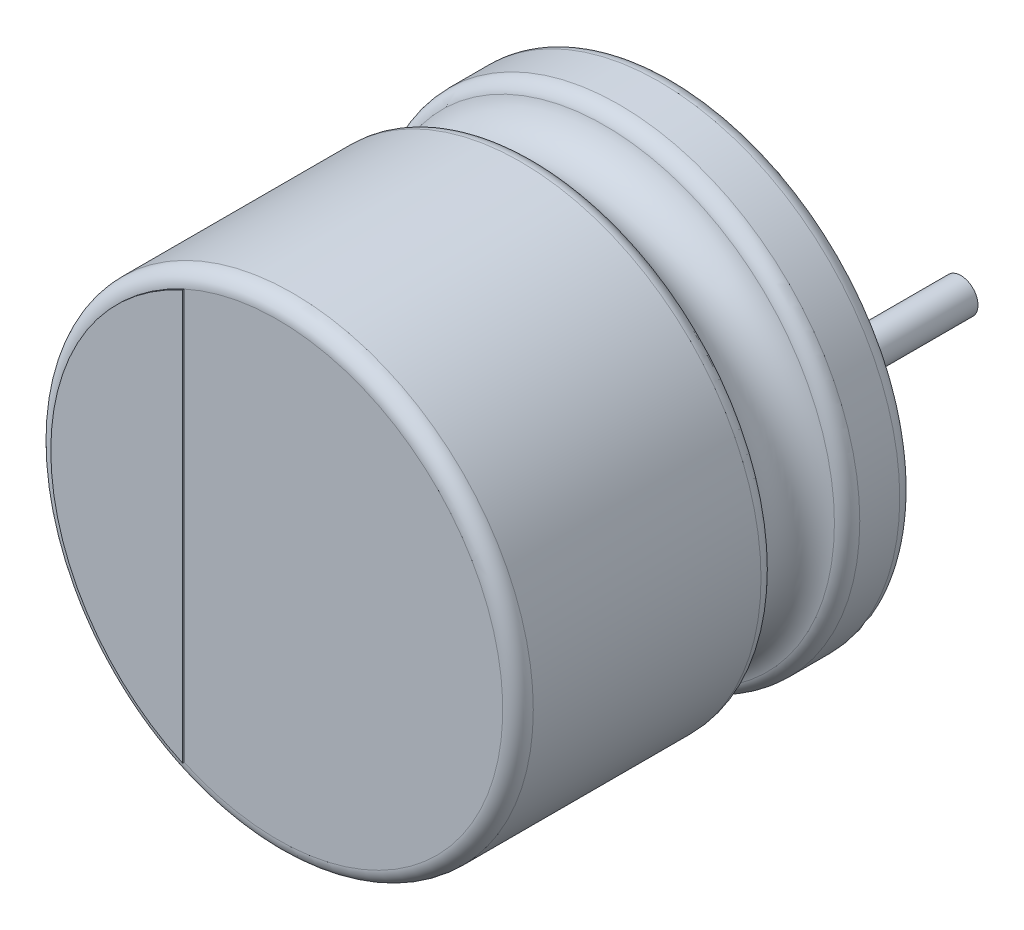
ISO-10303-21;
HEADER;
FILE_DESCRIPTION(('STEP AP214'),'2;1');
FILE_NAME('part.step','',(''),(''),'','','');
FILE_SCHEMA(('AUTOMOTIVE_DESIGN { 1 0 10303 214 1 1 1 1 }'));
ENDSEC;
DATA;
#1=APPLICATION_CONTEXT('core data for automotive mechanical design processes');
#2=APPLICATION_PROTOCOL_DEFINITION('international standard','automotive_design',2000,#1);
#3=PRODUCT_CONTEXT('',#1,'mechanical');
#4=PRODUCT('Part','Part','',(#3));
#5=PRODUCT_RELATED_PRODUCT_CATEGORY('part','',(#4));
#6=PRODUCT_DEFINITION_FORMATION('','',#4);
#7=PRODUCT_DEFINITION_CONTEXT('part definition',#1,'design');
#8=PRODUCT_DEFINITION('design','',#6,#7);
#9=PRODUCT_DEFINITION_SHAPE('','',#8);
#10=(LENGTH_UNIT() NAMED_UNIT(*) SI_UNIT(.MILLI.,.METRE.));
#11=(NAMED_UNIT(*) PLANE_ANGLE_UNIT() SI_UNIT($,.RADIAN.));
#12=(NAMED_UNIT(*) SI_UNIT($,.STERADIAN.) SOLID_ANGLE_UNIT());
#13=UNCERTAINTY_MEASURE_WITH_UNIT(LENGTH_MEASURE(1.E-05),#10,'distance_accuracy_value','');
#14=(GEOMETRIC_REPRESENTATION_CONTEXT(3) GLOBAL_UNCERTAINTY_ASSIGNED_CONTEXT((#13)) GLOBAL_UNIT_ASSIGNED_CONTEXT((#10,
#11,#12)) REPRESENTATION_CONTEXT('',''));
#15=CARTESIAN_POINT('',(0.,0.,0.));
#16=DIRECTION('',(0.,0.,1.));
#17=DIRECTION('',(1.,0.,0.));
#18=AXIS2_PLACEMENT_3D('',#15,#16,#17);
#19=CARTESIAN_POINT('',(-1.25,0.,-2.5));
#20=DIRECTION('',(0.,0.,1.));
#21=DIRECTION('',(1.,0.,0.));
#22=AXIS2_PLACEMENT_3D('',#19,#20,#21);
#23=CYLINDRICAL_SURFACE('',#22,0.225);
#24=CARTESIAN_POINT('',(-1.25,0.,-2.5));
#25=DIRECTION('',(0.,0.,1.));
#26=DIRECTION('',(-1.,0.,0.));
#27=AXIS2_PLACEMENT_3D('',#24,#25,#26);
#28=CIRCLE('',#27,0.225);
#29=CARTESIAN_POINT('',(-1.475,0.,-2.5));
#30=VERTEX_POINT('',#29);
#31=EDGE_CURVE('P0_E10',#30,#30,#28,.T.);
#32=ORIENTED_EDGE('',*,*,#31,.T.);
#33=EDGE_LOOP('',(#32));
#34=FACE_BOUND('',#33,.T.);
#35=CARTESIAN_POINT('',(-1.25,0.,0.));
#36=DIRECTION('',(0.,0.,1.));
#37=DIRECTION('',(-1.,0.,0.));
#38=AXIS2_PLACEMENT_3D('',#35,#36,#37);
#39=CIRCLE('',#38,0.225);
#40=CARTESIAN_POINT('',(-1.475,0.,0.));
#41=VERTEX_POINT('',#40);
#42=EDGE_CURVE('P0_E18',#41,#41,#39,.T.);
#43=ORIENTED_EDGE('',*,*,#42,.F.);
#44=EDGE_LOOP('',(#43));
#45=FACE_BOUND('',#44,.T.);
#46=ADVANCED_FACE('P0_F15',(#34,#45),#23,.T.);
#47=CARTESIAN_POINT('',(-1.25,0.,-2.5));
#48=DIRECTION('',(0.,0.,-1.));
#49=DIRECTION('',(-1.,0.,0.));
#50=AXIS2_PLACEMENT_3D('',#47,#48,#49);
#51=PLANE('',#50);
#52=ORIENTED_EDGE('',*,*,#31,.F.);
#53=EDGE_LOOP('',(#52));
#54=FACE_BOUND('',#53,.T.);
#55=ADVANCED_FACE('P0_F30',(#54),#51,.T.);
#56=CARTESIAN_POINT('',(-1.25,0.,0.));
#57=DIRECTION('',(0.,0.,-1.));
#58=DIRECTION('',(-1.,0.,0.));
#59=AXIS2_PLACEMENT_3D('',#56,#57,#58);
#60=PLANE('',#59);
#61=ORIENTED_EDGE('',*,*,#42,.T.);
#62=EDGE_LOOP('',(#61));
#63=FACE_BOUND('',#62,.T.);
#64=ADVANCED_FACE('P0_F27',(#63),#60,.F.);
#65=CLOSED_SHELL('',(#46,#55,#64));
#66=MANIFOLD_SOLID_BREP('P0_B1',#65);
#67=CARTESIAN_POINT('',(1.25,0.,-2.5));
#68=DIRECTION('',(0.,0.,1.));
#69=DIRECTION('',(1.,0.,0.));
#70=AXIS2_PLACEMENT_3D('',#67,#68,#69);
#71=CYLINDRICAL_SURFACE('',#70,0.225);
#72=CARTESIAN_POINT('',(1.25,0.,-2.5));
#73=DIRECTION('',(0.,0.,1.));
#74=DIRECTION('',(1.,0.,0.));
#75=AXIS2_PLACEMENT_3D('',#72,#73,#74);
#76=CIRCLE('',#75,0.225);
#77=CARTESIAN_POINT('',(1.475,0.,-2.5));
#78=VERTEX_POINT('',#77);
#79=EDGE_CURVE('P1_E10',#78,#78,#76,.T.);
#80=ORIENTED_EDGE('',*,*,#79,.T.);
#81=EDGE_LOOP('',(#80));
#82=FACE_BOUND('',#81,.T.);
#83=CARTESIAN_POINT('',(1.25,0.,0.));
#84=DIRECTION('',(0.,0.,1.));
#85=DIRECTION('',(1.,0.,0.));
#86=AXIS2_PLACEMENT_3D('',#83,#84,#85);
#87=CIRCLE('',#86,0.225);
#88=CARTESIAN_POINT('',(1.475,0.,0.));
#89=VERTEX_POINT('',#88);
#90=EDGE_CURVE('P1_E18',#89,#89,#87,.T.);
#91=ORIENTED_EDGE('',*,*,#90,.F.);
#92=EDGE_LOOP('',(#91));
#93=FACE_BOUND('',#92,.T.);
#94=ADVANCED_FACE('P1_F15',(#82,#93),#71,.T.);
#95=CARTESIAN_POINT('',(1.25,0.,-2.5));
#96=DIRECTION('',(0.,0.,1.));
#97=DIRECTION('',(1.,0.,0.));
#98=AXIS2_PLACEMENT_3D('',#95,#96,#97);
#99=PLANE('',#98);
#100=ORIENTED_EDGE('',*,*,#79,.F.);
#101=EDGE_LOOP('',(#100));
#102=FACE_BOUND('',#101,.T.);
#103=ADVANCED_FACE('P1_F30',(#102),#99,.F.);
#104=CARTESIAN_POINT('',(1.25,0.,0.));
#105=DIRECTION('',(0.,0.,1.));
#106=DIRECTION('',(1.,0.,0.));
#107=AXIS2_PLACEMENT_3D('',#104,#105,#106);
#108=PLANE('',#107);
#109=ORIENTED_EDGE('',*,*,#90,.T.);
#110=EDGE_LOOP('',(#109));
#111=FACE_BOUND('',#110,.T.);
#112=ADVANCED_FACE('P1_F27',(#111),#108,.T.);
#113=CLOSED_SHELL('',(#94,#103,#112));
#114=MANIFOLD_SOLID_BREP('P1_B1',#113);
#115=CARTESIAN_POINT('',(0.,0.,5.2));
#116=DIRECTION('',(0.,0.,1.));
#117=DIRECTION('',(1.,0.,0.));
#118=AXIS2_PLACEMENT_3D('',#115,#116,#117);
#119=PLANE('',#118);
#120=CARTESIAN_POINT('',(0.,0.,5.2));
#121=DIRECTION('',(0.,0.,-1.));
#122=DIRECTION('',(-1.,0.,0.));
#123=AXIS2_PLACEMENT_3D('',#120,#121,#122);
#124=CIRCLE('',#123,2.95);
#125=CARTESIAN_POINT('',(-2.95,0.,5.2));
#126=VERTEX_POINT('',#125);
#127=EDGE_CURVE('P2_E9',#126,#126,#124,.T.);
#128=ORIENTED_EDGE('',*,*,#127,.F.);
#129=EDGE_LOOP('',(#128));
#130=FACE_BOUND('',#129,.T.);
#131=ADVANCED_FACE('P2_F14',(#130),#119,.T.);
#132=CARTESIAN_POINT('',(0.,0.,5.));
#133=DIRECTION('',(0.,0.,-1.));
#134=DIRECTION('',(-1.,0.,0.));
#135=AXIS2_PLACEMENT_3D('',#132,#133,#134);
#136=TOROIDAL_SURFACE('',#135,2.95,0.2);
#137=ORIENTED_EDGE('',*,*,#127,.T.);
#138=EDGE_LOOP('',(#137));
#139=FACE_BOUND('',#138,.T.);
#140=CARTESIAN_POINT('',(0.,0.,5.));
#141=DIRECTION('',(0.,0.,-1.));
#142=DIRECTION('',(-1.,0.,0.));
#143=AXIS2_PLACEMENT_3D('',#140,#141,#142);
#144=CIRCLE('',#143,3.15);
#145=CARTESIAN_POINT('',(-3.15,0.,5.));
#146=VERTEX_POINT('',#145);
#147=EDGE_CURVE('P2_E20',#146,#146,#144,.T.);
#148=ORIENTED_EDGE('',*,*,#147,.F.);
#149=EDGE_LOOP('',(#148));
#150=FACE_BOUND('',#149,.T.);
#151=ADVANCED_FACE('P2_F65',(#139,#150),#136,.T.);
#152=CARTESIAN_POINT('',(0.,0.,0.));
#153=DIRECTION('',(0.,0.,-1.));
#154=DIRECTION('',(-1.,0.,0.));
#155=AXIS2_PLACEMENT_3D('',#152,#153,#154);
#156=CYLINDRICAL_SURFACE('',#155,3.15);
#157=ORIENTED_EDGE('',*,*,#147,.T.);
#158=EDGE_LOOP('',(#157));
#159=FACE_BOUND('',#158,.T.);
#160=CARTESIAN_POINT('',(0.,0.,2.01727304928868));
#161=DIRECTION('',(0.,0.,-1.));
#162=DIRECTION('',(-1.,0.,0.));
#163=AXIS2_PLACEMENT_3D('',#160,#161,#162);
#164=CIRCLE('',#163,3.15);
#165=CARTESIAN_POINT('',(-3.15,0.,2.01727304928868));
#166=VERTEX_POINT('',#165);
#167=EDGE_CURVE('P2_E24',#166,#166,#164,.T.);
#168=ORIENTED_EDGE('',*,*,#167,.F.);
#169=EDGE_LOOP('',(#168));
#170=FACE_BOUND('',#169,.T.);
#171=ADVANCED_FACE('P2_F71',(#159,#170),#156,.T.);
#172=CARTESIAN_POINT('',(0.,0.,2.01727304928868));
#173=DIRECTION('',(0.,0.,-1.));
#174=DIRECTION('',(-1.,0.,0.));
#175=AXIS2_PLACEMENT_3D('',#172,#173,#174);
#176=TOROIDAL_SURFACE('',#175,2.95,0.2);
#177=ORIENTED_EDGE('',*,*,#167,.T.);
#178=EDGE_LOOP('',(#177));
#179=FACE_BOUND('',#178,.T.);
#180=CARTESIAN_POINT('',(0.,0.,1.82619677081843));
#181=DIRECTION('',(0.,0.,-1.));
#182=DIRECTION('',(-1.,0.,0.));
#183=AXIS2_PLACEMENT_3D('',#180,#181,#182);
#184=CIRCLE('',#183,3.00907500153159);
#185=CARTESIAN_POINT('',(-3.00907500153159,0.,1.82619677081843));
#186=VERTEX_POINT('',#185);
#187=EDGE_CURVE('P2_E28',#186,#186,#184,.T.);
#188=ORIENTED_EDGE('',*,*,#187,.F.);
#189=EDGE_LOOP('',(#188));
#190=FACE_BOUND('',#189,.T.);
#191=ADVANCED_FACE('P2_F76',(#179,#190),#176,.T.);
#192=CARTESIAN_POINT('',(0.,0.,1.37037919057903));
#193=DIRECTION('',(0.,0.,-1.));
#194=DIRECTION('',(-1.,0.,0.));
#195=AXIS2_PLACEMENT_3D('',#192,#193,#194);
#196=TOROIDAL_SURFACE('',#195,3.15,0.477105356969109);
#197=ORIENTED_EDGE('',*,*,#187,.T.);
#198=EDGE_LOOP('',(#197));
#199=FACE_BOUND('',#198,.T.);
#200=CARTESIAN_POINT('',(0.,0.,0.914561610339631));
#201=DIRECTION('',(0.,0.,-1.));
#202=DIRECTION('',(-1.,0.,0.));
#203=AXIS2_PLACEMENT_3D('',#200,#201,#202);
#204=CIRCLE('',#203,3.00907500153159);
#205=CARTESIAN_POINT('',(-3.00907500153159,0.,0.914561610339631));
#206=VERTEX_POINT('',#205);
#207=EDGE_CURVE('P2_E33',#206,#206,#204,.T.);
#208=ORIENTED_EDGE('',*,*,#207,.F.);
#209=EDGE_LOOP('',(#208));
#210=FACE_BOUND('',#209,.T.);
#211=ADVANCED_FACE('P2_F82',(#199,#210),#196,.F.);
#212=CARTESIAN_POINT('',(0.,0.,0.723485331869376));
#213=DIRECTION('',(0.,0.,-1.));
#214=DIRECTION('',(-1.,0.,0.));
#215=AXIS2_PLACEMENT_3D('',#212,#213,#214);
#216=TOROIDAL_SURFACE('',#215,2.95,0.2);
#217=ORIENTED_EDGE('',*,*,#207,.T.);
#218=EDGE_LOOP('',(#217));
#219=FACE_BOUND('',#218,.T.);
#220=CARTESIAN_POINT('',(0.,0.,0.723485331869376));
#221=DIRECTION('',(0.,0.,-1.));
#222=DIRECTION('',(-1.,0.,0.));
#223=AXIS2_PLACEMENT_3D('',#220,#221,#222);
#224=CIRCLE('',#223,3.15);
#225=CARTESIAN_POINT('',(-3.15,0.,0.723485331869376));
#226=VERTEX_POINT('',#225);
#227=EDGE_CURVE('P2_E36',#226,#226,#224,.T.);
#228=ORIENTED_EDGE('',*,*,#227,.F.);
#229=EDGE_LOOP('',(#228));
#230=FACE_BOUND('',#229,.T.);
#231=ADVANCED_FACE('P2_F61',(#219,#230),#216,.T.);
#232=CARTESIAN_POINT('',(0.,0.,0.));
#233=DIRECTION('',(0.,0.,-1.));
#234=DIRECTION('',(-1.,0.,0.));
#235=AXIS2_PLACEMENT_3D('',#232,#233,#234);
#236=CYLINDRICAL_SURFACE('',#235,3.15);
#237=ORIENTED_EDGE('',*,*,#227,.T.);
#238=EDGE_LOOP('',(#237));
#239=FACE_BOUND('',#238,.T.);
#240=CARTESIAN_POINT('',(0.,0.,0.2));
#241=DIRECTION('',(0.,0.,-1.));
#242=DIRECTION('',(-1.,0.,0.));
#243=AXIS2_PLACEMENT_3D('',#240,#241,#242);
#244=CIRCLE('',#243,3.15);
#245=CARTESIAN_POINT('',(-3.15,0.,0.2));
#246=VERTEX_POINT('',#245);
#247=EDGE_CURVE('P2_E39',#246,#246,#244,.T.);
#248=ORIENTED_EDGE('',*,*,#247,.F.);
#249=EDGE_LOOP('',(#248));
#250=FACE_BOUND('',#249,.T.);
#251=ADVANCED_FACE('P2_F50',(#239,#250),#236,.T.);
#252=CARTESIAN_POINT('',(0.,0.,0.2));
#253=DIRECTION('',(0.,0.,-1.));
#254=DIRECTION('',(-1.,0.,0.));
#255=AXIS2_PLACEMENT_3D('',#252,#253,#254);
#256=TOROIDAL_SURFACE('',#255,2.95,0.2);
#257=ORIENTED_EDGE('',*,*,#247,.T.);
#258=EDGE_LOOP('',(#257));
#259=FACE_BOUND('',#258,.T.);
#260=CARTESIAN_POINT('',(0.,0.,0.));
#261=DIRECTION('',(0.,0.,-1.));
#262=DIRECTION('',(-1.,0.,0.));
#263=AXIS2_PLACEMENT_3D('',#260,#261,#262);
#264=CIRCLE('',#263,2.95);
#265=CARTESIAN_POINT('',(-2.95,0.,0.));
#266=VERTEX_POINT('',#265);
#267=EDGE_CURVE('P2_E42',#266,#266,#264,.T.);
#268=ORIENTED_EDGE('',*,*,#267,.F.);
#269=EDGE_LOOP('',(#268));
#270=FACE_BOUND('',#269,.T.);
#271=ADVANCED_FACE('P2_F48',(#259,#270),#256,.T.);
#272=CARTESIAN_POINT('',(0.,0.,0.));
#273=DIRECTION('',(0.,0.,-1.));
#274=DIRECTION('',(-1.,0.,0.));
#275=AXIS2_PLACEMENT_3D('',#272,#273,#274);
#276=PLANE('',#275);
#277=ORIENTED_EDGE('',*,*,#267,.T.);
#278=EDGE_LOOP('',(#277));
#279=FACE_BOUND('',#278,.T.);
#280=ADVANCED_FACE('P2_F46',(#279),#276,.T.);
#281=CLOSED_SHELL('',(#131,#151,#171,#191,#211,#231,#251,#271,#280));
#282=MANIFOLD_SOLID_BREP('P2_B1',#281);
#283=CARTESIAN_POINT('',(0.,0.,5.22));
#284=DIRECTION('',(0.,0.,-1.));
#285=DIRECTION('',(-1.,0.,0.));
#286=AXIS2_PLACEMENT_3D('',#283,#284,#285);
#287=CYLINDRICAL_SURFACE('',#286,2.95);
#288=CARTESIAN_POINT('',(0.,0.,5.2));
#289=DIRECTION('',(0.,0.,1.));
#290=DIRECTION('',(1.,0.,0.));
#291=AXIS2_PLACEMENT_3D('',#288,#289,#290);
#292=CIRCLE('',#291,2.95);
#293=CARTESIAN_POINT('',(-1.22242400319062,2.68480531071127,5.2));
#294=VERTEX_POINT('',#293);
#295=CARTESIAN_POINT('',(-1.22242400319062,-2.68480531071127,5.2));
#296=VERTEX_POINT('',#295);
#297=EDGE_CURVE('P3_E47',#294,#296,#292,.T.);
#298=ORIENTED_EDGE('',*,*,#297,.T.);
#299=DIRECTION('',(0.,0.,-1.));
#300=VECTOR('',#299,1.);
#301=CARTESIAN_POINT('',(-1.22242400319062,-2.68480531071127,5.22));
#302=LINE('',#301,#300);
#303=CARTESIAN_POINT('',(-1.22242400319062,-2.68480531071127,5.22));
#304=VERTEX_POINT('',#303);
#305=EDGE_CURVE('P3_E10',#304,#296,#302,.T.);
#306=ORIENTED_EDGE('',*,*,#305,.F.);
#307=CARTESIAN_POINT('',(0.,0.,5.22));
#308=DIRECTION('',(0.,0.,1.));
#309=DIRECTION('',(1.,0.,0.));
#310=AXIS2_PLACEMENT_3D('',#307,#308,#309);
#311=CIRCLE('',#310,2.95);
#312=CARTESIAN_POINT('',(-1.22242400319062,2.68480531071127,5.22));
#313=VERTEX_POINT('',#312);
#314=EDGE_CURVE('P3_E46',#313,#304,#311,.T.);
#315=ORIENTED_EDGE('',*,*,#314,.F.);
#316=DIRECTION('',(0.,0.,-1.));
#317=VECTOR('',#316,1.);
#318=CARTESIAN_POINT('',(-1.22242400319062,2.68480531071127,5.22));
#319=LINE('',#318,#317);
#320=EDGE_CURVE('P3_E24',#313,#294,#319,.T.);
#321=ORIENTED_EDGE('',*,*,#320,.T.);
#322=EDGE_LOOP('',(#298,#306,#315,#321));
#323=FACE_BOUND('',#322,.T.);
#324=ADVANCED_FACE('P3_F16',(#323),#287,.T.);
#325=CARTESIAN_POINT('',(-1.22242400319062,2.68480531071127,5.22));
#326=DIRECTION('',(-1.,0.,0.));
#327=DIRECTION('',(0.,0.,1.));
#328=AXIS2_PLACEMENT_3D('',#325,#326,#327);
#329=PLANE('',#328);
#330=DIRECTION('',(0.,1.,0.));
#331=VECTOR('',#330,1.);
#332=CARTESIAN_POINT('',(-1.22242400319062,2.68480531071127,5.2));
#333=LINE('',#332,#331);
#334=EDGE_CURVE('P3_E39',#296,#294,#333,.T.);
#335=ORIENTED_EDGE('',*,*,#334,.T.);
#336=ORIENTED_EDGE('',*,*,#320,.F.);
#337=DIRECTION('',(0.,1.,0.));
#338=VECTOR('',#337,1.);
#339=CARTESIAN_POINT('',(-1.22242400319062,2.68480531071127,5.22));
#340=LINE('',#339,#338);
#341=EDGE_CURVE('P3_E31',#304,#313,#340,.T.);
#342=ORIENTED_EDGE('',*,*,#341,.F.);
#343=ORIENTED_EDGE('',*,*,#305,.T.);
#344=EDGE_LOOP('',(#335,#336,#342,#343));
#345=FACE_BOUND('',#344,.T.);
#346=ADVANCED_FACE('P3_F42',(#345),#329,.F.);
#347=CARTESIAN_POINT('',(0.,0.,5.22));
#348=DIRECTION('',(0.,0.,1.));
#349=DIRECTION('',(1.,0.,0.));
#350=AXIS2_PLACEMENT_3D('',#347,#348,#349);
#351=PLANE('',#350);
#352=ORIENTED_EDGE('',*,*,#314,.T.);
#353=ORIENTED_EDGE('',*,*,#341,.T.);
#354=EDGE_LOOP('',(#352,#353));
#355=FACE_BOUND('',#354,.T.);
#356=ADVANCED_FACE('P3_F54',(#355),#351,.T.);
#357=CARTESIAN_POINT('',(0.,0.,5.2));
#358=DIRECTION('',(0.,0.,1.));
#359=DIRECTION('',(1.,0.,0.));
#360=AXIS2_PLACEMENT_3D('',#357,#358,#359);
#361=PLANE('',#360);
#362=ORIENTED_EDGE('',*,*,#297,.F.);
#363=ORIENTED_EDGE('',*,*,#334,.F.);
#364=EDGE_LOOP('',(#362,#363));
#365=FACE_BOUND('',#364,.T.);
#366=ADVANCED_FACE('P3_F50',(#365),#361,.F.);
#367=CLOSED_SHELL('',(#324,#346,#356,#366));
#368=MANIFOLD_SOLID_BREP('P3_B1',#367);
#369=ADVANCED_BREP_SHAPE_REPRESENTATION('',(#18,#66,#114,#282,#368),#14);
#370=SHAPE_DEFINITION_REPRESENTATION(#9,#369);
ENDSEC;
END-ISO-10303-21;
